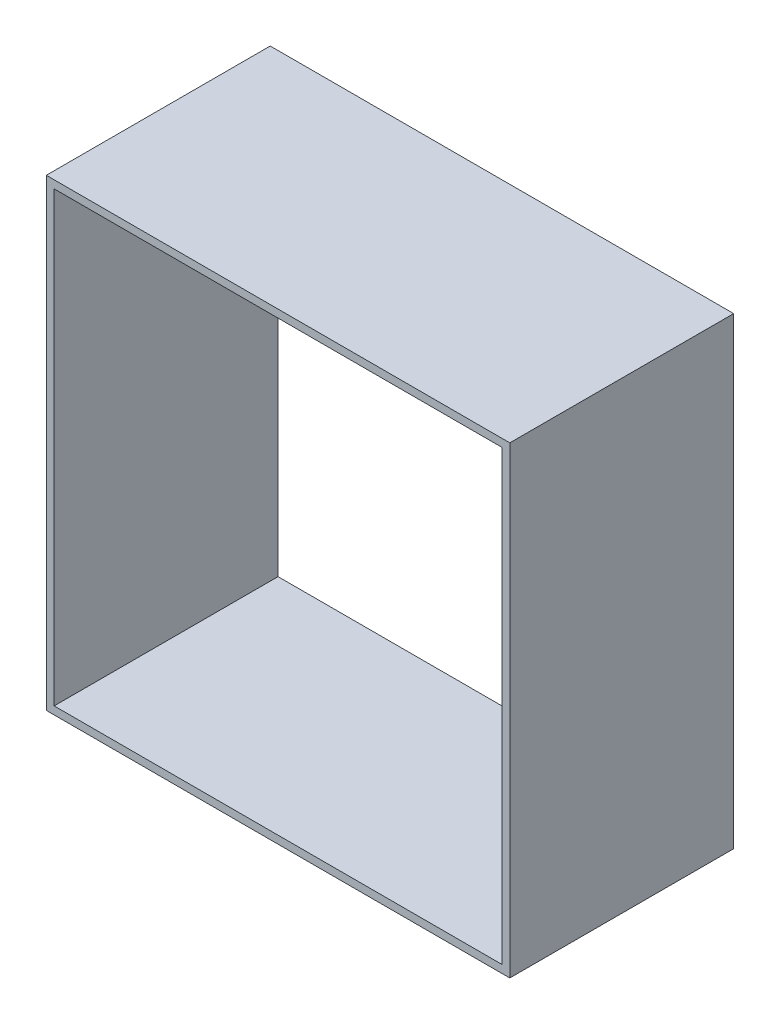
ISO-10303-21;
HEADER;
FILE_DESCRIPTION(('STEP AP214'),'2;1');
FILE_NAME('part.step','',(''),(''),'','','');
FILE_SCHEMA(('AUTOMOTIVE_DESIGN { 1 0 10303 214 1 1 1 1 }'));
ENDSEC;
DATA;
#1=APPLICATION_CONTEXT('core data for automotive mechanical design processes');
#2=APPLICATION_PROTOCOL_DEFINITION('international standard','automotive_design',2000,#1);
#3=PRODUCT_CONTEXT('',#1,'mechanical');
#4=PRODUCT('Part','Part','',(#3));
#5=PRODUCT_RELATED_PRODUCT_CATEGORY('part','',(#4));
#6=PRODUCT_DEFINITION_FORMATION('','',#4);
#7=PRODUCT_DEFINITION_CONTEXT('part definition',#1,'design');
#8=PRODUCT_DEFINITION('design','',#6,#7);
#9=PRODUCT_DEFINITION_SHAPE('','',#8);
#10=(LENGTH_UNIT() NAMED_UNIT(*) SI_UNIT(.MILLI.,.METRE.));
#11=(NAMED_UNIT(*) PLANE_ANGLE_UNIT() SI_UNIT($,.RADIAN.));
#12=(NAMED_UNIT(*) SI_UNIT($,.STERADIAN.) SOLID_ANGLE_UNIT());
#13=UNCERTAINTY_MEASURE_WITH_UNIT(LENGTH_MEASURE(1.E-05),#10,'distance_accuracy_value','');
#14=(GEOMETRIC_REPRESENTATION_CONTEXT(3) GLOBAL_UNCERTAINTY_ASSIGNED_CONTEXT((#13)) GLOBAL_UNIT_ASSIGNED_CONTEXT((#10,
#11,#12)) REPRESENTATION_CONTEXT('',''));
#15=CARTESIAN_POINT('',(0.,0.,0.));
#16=DIRECTION('',(0.,0.,1.));
#17=DIRECTION('',(1.,0.,0.));
#18=AXIS2_PLACEMENT_3D('',#15,#16,#17);
#19=CARTESIAN_POINT('',(10.35,-10.35,10.));
#20=DIRECTION('',(0.,0.,1.));
#21=DIRECTION('',(1.,0.,0.));
#22=AXIS2_PLACEMENT_3D('',#19,#20,#21);
#23=PLANE('',#22);
#24=DIRECTION('',(0.,1.,0.));
#25=VECTOR('',#24,1.);
#26=CARTESIAN_POINT('',(10.35,10.35,10.));
#27=LINE('',#26,#25);
#28=CARTESIAN_POINT('',(10.35,-10.35,10.));
#29=VERTEX_POINT('',#28);
#30=CARTESIAN_POINT('',(10.35,10.35,10.));
#31=VERTEX_POINT('',#30);
#32=EDGE_CURVE('E132',#29,#31,#27,.T.);
#33=ORIENTED_EDGE('',*,*,#32,.T.);
#34=DIRECTION('',(-1.,0.,0.));
#35=VECTOR('',#34,1.);
#36=CARTESIAN_POINT('',(-10.35,10.35,10.));
#37=LINE('',#36,#35);
#38=CARTESIAN_POINT('',(-10.35,10.35,10.));
#39=VERTEX_POINT('',#38);
#40=EDGE_CURVE('E135',#31,#39,#37,.T.);
#41=ORIENTED_EDGE('',*,*,#40,.T.);
#42=DIRECTION('',(0.,-1.,0.));
#43=VECTOR('',#42,1.);
#44=CARTESIAN_POINT('',(-10.35,10.35,10.));
#45=LINE('',#44,#43);
#46=CARTESIAN_POINT('',(-10.35,-10.35,10.));
#47=VERTEX_POINT('',#46);
#48=EDGE_CURVE('E138',#39,#47,#45,.T.);
#49=ORIENTED_EDGE('',*,*,#48,.T.);
#50=DIRECTION('',(1.,0.,0.));
#51=VECTOR('',#50,1.);
#52=CARTESIAN_POINT('',(-10.35,-10.35,10.));
#53=LINE('',#52,#51);
#54=EDGE_CURVE('E140',#47,#29,#53,.T.);
#55=ORIENTED_EDGE('',*,*,#54,.T.);
#56=EDGE_LOOP('',(#33,#41,#49,#55));
#57=FACE_BOUND('',#56,.T.);
#58=DIRECTION('',(-1.,0.,0.));
#59=VECTOR('',#58,1.);
#60=CARTESIAN_POINT('',(-10.,9.99999999999999,10.));
#61=LINE('',#60,#59);
#62=CARTESIAN_POINT('',(10.,9.99999999999999,10.));
#63=VERTEX_POINT('',#62);
#64=CARTESIAN_POINT('',(-10.,9.99999999999999,10.));
#65=VERTEX_POINT('',#64);
#66=EDGE_CURVE('E104',#63,#65,#61,.T.);
#67=ORIENTED_EDGE('',*,*,#66,.F.);
#68=DIRECTION('',(0.,1.,0.));
#69=VECTOR('',#68,1.);
#70=CARTESIAN_POINT('',(10.,9.99999999999999,10.));
#71=LINE('',#70,#69);
#72=CARTESIAN_POINT('',(10.,-10.,10.));
#73=VERTEX_POINT('',#72);
#74=EDGE_CURVE('E96',#73,#63,#71,.T.);
#75=ORIENTED_EDGE('',*,*,#74,.F.);
#76=DIRECTION('',(1.,0.,0.));
#77=VECTOR('',#76,1.);
#78=CARTESIAN_POINT('',(-10.,-10.,10.));
#79=LINE('',#78,#77);
#80=CARTESIAN_POINT('',(-10.,-10.,10.));
#81=VERTEX_POINT('',#80);
#82=EDGE_CURVE('E118',#81,#73,#79,.T.);
#83=ORIENTED_EDGE('',*,*,#82,.F.);
#84=DIRECTION('',(0.,-1.,0.));
#85=VECTOR('',#84,1.);
#86=CARTESIAN_POINT('',(-10.,9.99999999999999,10.));
#87=LINE('',#86,#85);
#88=EDGE_CURVE('E116',#65,#81,#87,.T.);
#89=ORIENTED_EDGE('',*,*,#88,.F.);
#90=EDGE_LOOP('',(#67,#75,#83,#89));
#91=FACE_BOUND('',#90,.T.);
#92=ADVANCED_FACE('F31',(#57,#91),#23,.T.);
#93=CARTESIAN_POINT('',(10.35,-10.35,0.));
#94=DIRECTION('',(0.,0.,1.));
#95=DIRECTION('',(1.,0.,0.));
#96=AXIS2_PLACEMENT_3D('',#93,#94,#95);
#97=PLANE('',#96);
#98=DIRECTION('',(0.,1.,0.));
#99=VECTOR('',#98,1.);
#100=CARTESIAN_POINT('',(10.35,10.35,0.));
#101=LINE('',#100,#99);
#102=CARTESIAN_POINT('',(10.35,-10.35,0.));
#103=VERTEX_POINT('',#102);
#104=CARTESIAN_POINT('',(10.35,10.35,0.));
#105=VERTEX_POINT('',#104);
#106=EDGE_CURVE('E112',#103,#105,#101,.T.);
#107=ORIENTED_EDGE('',*,*,#106,.F.);
#108=DIRECTION('',(1.,0.,0.));
#109=VECTOR('',#108,1.);
#110=CARTESIAN_POINT('',(-10.35,-10.35,0.));
#111=LINE('',#110,#109);
#112=CARTESIAN_POINT('',(-10.35,-10.35,0.));
#113=VERTEX_POINT('',#112);
#114=EDGE_CURVE('E136',#113,#103,#111,.T.);
#115=ORIENTED_EDGE('',*,*,#114,.F.);
#116=DIRECTION('',(0.,-1.,0.));
#117=VECTOR('',#116,1.);
#118=CARTESIAN_POINT('',(-10.35,10.35,0.));
#119=LINE('',#118,#117);
#120=CARTESIAN_POINT('',(-10.35,10.35,0.));
#121=VERTEX_POINT('',#120);
#122=EDGE_CURVE('E147',#121,#113,#119,.T.);
#123=ORIENTED_EDGE('',*,*,#122,.F.);
#124=DIRECTION('',(-1.,0.,0.));
#125=VECTOR('',#124,1.);
#126=CARTESIAN_POINT('',(-10.35,10.35,0.));
#127=LINE('',#126,#125);
#128=EDGE_CURVE('E145',#105,#121,#127,.T.);
#129=ORIENTED_EDGE('',*,*,#128,.F.);
#130=EDGE_LOOP('',(#107,#115,#123,#129));
#131=FACE_BOUND('',#130,.T.);
#132=DIRECTION('',(0.,1.,0.));
#133=VECTOR('',#132,1.);
#134=CARTESIAN_POINT('',(10.,9.99999999999999,0.));
#135=LINE('',#134,#133);
#136=CARTESIAN_POINT('',(10.,-10.,0.));
#137=VERTEX_POINT('',#136);
#138=CARTESIAN_POINT('',(10.,9.99999999999999,0.));
#139=VERTEX_POINT('',#138);
#140=EDGE_CURVE('E54',#137,#139,#135,.T.);
#141=ORIENTED_EDGE('',*,*,#140,.T.);
#142=DIRECTION('',(-1.,0.,0.));
#143=VECTOR('',#142,1.);
#144=CARTESIAN_POINT('',(-10.,9.99999999999999,0.));
#145=LINE('',#144,#143);
#146=CARTESIAN_POINT('',(-10.,9.99999999999999,0.));
#147=VERTEX_POINT('',#146);
#148=EDGE_CURVE('E111',#139,#147,#145,.T.);
#149=ORIENTED_EDGE('',*,*,#148,.T.);
#150=DIRECTION('',(0.,-1.,0.));
#151=VECTOR('',#150,1.);
#152=CARTESIAN_POINT('',(-10.,9.99999999999999,0.));
#153=LINE('',#152,#151);
#154=CARTESIAN_POINT('',(-10.,-10.,0.));
#155=VERTEX_POINT('',#154);
#156=EDGE_CURVE('E124',#147,#155,#153,.T.);
#157=ORIENTED_EDGE('',*,*,#156,.T.);
#158=DIRECTION('',(1.,0.,0.));
#159=VECTOR('',#158,1.);
#160=CARTESIAN_POINT('',(-10.,-10.,0.));
#161=LINE('',#160,#159);
#162=EDGE_CURVE('E105',#155,#137,#161,.T.);
#163=ORIENTED_EDGE('',*,*,#162,.T.);
#164=EDGE_LOOP('',(#141,#149,#157,#163));
#165=FACE_BOUND('',#164,.T.);
#166=ADVANCED_FACE('F165',(#131,#165),#97,.F.);
#167=CARTESIAN_POINT('',(10.35,10.35,10.));
#168=DIRECTION('',(-1.,0.,0.));
#169=DIRECTION('',(0.,0.,1.));
#170=AXIS2_PLACEMENT_3D('',#167,#168,#169);
#171=PLANE('',#170);
#172=ORIENTED_EDGE('',*,*,#106,.T.);
#173=DIRECTION('',(0.,0.,-1.));
#174=VECTOR('',#173,1.);
#175=CARTESIAN_POINT('',(10.35,10.35,10.));
#176=LINE('',#175,#174);
#177=EDGE_CURVE('E11',#31,#105,#176,.T.);
#178=ORIENTED_EDGE('',*,*,#177,.F.);
#179=ORIENTED_EDGE('',*,*,#32,.F.);
#180=DIRECTION('',(0.,0.,-1.));
#181=VECTOR('',#180,1.);
#182=CARTESIAN_POINT('',(10.35,-10.35,10.));
#183=LINE('',#182,#181);
#184=EDGE_CURVE('E142',#29,#103,#183,.T.);
#185=ORIENTED_EDGE('',*,*,#184,.T.);
#186=EDGE_LOOP('',(#172,#178,#179,#185));
#187=FACE_BOUND('',#186,.T.);
#188=ADVANCED_FACE('F33',(#187),#171,.F.);
#189=CARTESIAN_POINT('',(-10.35,10.35,10.));
#190=DIRECTION('',(0.,-1.,0.));
#191=DIRECTION('',(0.,0.,-1.));
#192=AXIS2_PLACEMENT_3D('',#189,#190,#191);
#193=PLANE('',#192);
#194=ORIENTED_EDGE('',*,*,#128,.T.);
#195=DIRECTION('',(0.,0.,-1.));
#196=VECTOR('',#195,1.);
#197=CARTESIAN_POINT('',(-10.35,10.35,10.));
#198=LINE('',#197,#196);
#199=EDGE_CURVE('E39',#39,#121,#198,.T.);
#200=ORIENTED_EDGE('',*,*,#199,.F.);
#201=ORIENTED_EDGE('',*,*,#40,.F.);
#202=ORIENTED_EDGE('',*,*,#177,.T.);
#203=EDGE_LOOP('',(#194,#200,#201,#202));
#204=FACE_BOUND('',#203,.T.);
#205=ADVANCED_FACE('F175',(#204),#193,.F.);
#206=CARTESIAN_POINT('',(-10.35,10.35,10.));
#207=DIRECTION('',(1.,0.,0.));
#208=DIRECTION('',(0.,0.,-1.));
#209=AXIS2_PLACEMENT_3D('',#206,#207,#208);
#210=PLANE('',#209);
#211=ORIENTED_EDGE('',*,*,#122,.T.);
#212=DIRECTION('',(0.,0.,-1.));
#213=VECTOR('',#212,1.);
#214=CARTESIAN_POINT('',(-10.35,-10.35,10.));
#215=LINE('',#214,#213);
#216=EDGE_CURVE('E152',#47,#113,#215,.T.);
#217=ORIENTED_EDGE('',*,*,#216,.F.);
#218=ORIENTED_EDGE('',*,*,#48,.F.);
#219=ORIENTED_EDGE('',*,*,#199,.T.);
#220=EDGE_LOOP('',(#211,#217,#218,#219));
#221=FACE_BOUND('',#220,.T.);
#222=ADVANCED_FACE('F159',(#221),#210,.F.);
#223=CARTESIAN_POINT('',(-10.35,-10.35,10.));
#224=DIRECTION('',(0.,1.,0.));
#225=DIRECTION('',(0.,0.,1.));
#226=AXIS2_PLACEMENT_3D('',#223,#224,#225);
#227=PLANE('',#226);
#228=ORIENTED_EDGE('',*,*,#114,.T.);
#229=ORIENTED_EDGE('',*,*,#184,.F.);
#230=ORIENTED_EDGE('',*,*,#54,.F.);
#231=ORIENTED_EDGE('',*,*,#216,.T.);
#232=EDGE_LOOP('',(#228,#229,#230,#231));
#233=FACE_BOUND('',#232,.T.);
#234=ADVANCED_FACE('F169',(#233),#227,.F.);
#235=CARTESIAN_POINT('',(10.,9.99999999999999,10.));
#236=DIRECTION('',(-1.,0.,0.));
#237=DIRECTION('',(0.,0.,1.));
#238=AXIS2_PLACEMENT_3D('',#235,#236,#237);
#239=PLANE('',#238);
#240=ORIENTED_EDGE('',*,*,#140,.F.);
#241=DIRECTION('',(0.,0.,-1.));
#242=VECTOR('',#241,1.);
#243=CARTESIAN_POINT('',(10.,-10.,10.));
#244=LINE('',#243,#242);
#245=EDGE_CURVE('E100',#73,#137,#244,.T.);
#246=ORIENTED_EDGE('',*,*,#245,.F.);
#247=ORIENTED_EDGE('',*,*,#74,.T.);
#248=DIRECTION('',(0.,0.,-1.));
#249=VECTOR('',#248,1.);
#250=CARTESIAN_POINT('',(10.,9.99999999999999,10.));
#251=LINE('',#250,#249);
#252=EDGE_CURVE('E99',#63,#139,#251,.T.);
#253=ORIENTED_EDGE('',*,*,#252,.T.);
#254=EDGE_LOOP('',(#240,#246,#247,#253));
#255=FACE_BOUND('',#254,.T.);
#256=ADVANCED_FACE('F98',(#255),#239,.T.);
#257=CARTESIAN_POINT('',(-10.,9.99999999999999,10.));
#258=DIRECTION('',(0.,-1.,0.));
#259=DIRECTION('',(0.,0.,-1.));
#260=AXIS2_PLACEMENT_3D('',#257,#258,#259);
#261=PLANE('',#260);
#262=ORIENTED_EDGE('',*,*,#148,.F.);
#263=ORIENTED_EDGE('',*,*,#252,.F.);
#264=ORIENTED_EDGE('',*,*,#66,.T.);
#265=DIRECTION('',(0.,0.,-1.));
#266=VECTOR('',#265,1.);
#267=CARTESIAN_POINT('',(-10.,9.99999999999999,10.));
#268=LINE('',#267,#266);
#269=EDGE_CURVE('E113',#65,#147,#268,.T.);
#270=ORIENTED_EDGE('',*,*,#269,.T.);
#271=EDGE_LOOP('',(#262,#263,#264,#270));
#272=FACE_BOUND('',#271,.T.);
#273=ADVANCED_FACE('F108',(#272),#261,.T.);
#274=CARTESIAN_POINT('',(-10.,9.99999999999999,10.));
#275=DIRECTION('',(1.,0.,0.));
#276=DIRECTION('',(0.,0.,-1.));
#277=AXIS2_PLACEMENT_3D('',#274,#275,#276);
#278=PLANE('',#277);
#279=ORIENTED_EDGE('',*,*,#156,.F.);
#280=ORIENTED_EDGE('',*,*,#269,.F.);
#281=ORIENTED_EDGE('',*,*,#88,.T.);
#282=DIRECTION('',(0.,0.,-1.));
#283=VECTOR('',#282,1.);
#284=CARTESIAN_POINT('',(-10.,-10.,10.));
#285=LINE('',#284,#283);
#286=EDGE_CURVE('E46',#81,#155,#285,.T.);
#287=ORIENTED_EDGE('',*,*,#286,.T.);
#288=EDGE_LOOP('',(#279,#280,#281,#287));
#289=FACE_BOUND('',#288,.T.);
#290=ADVANCED_FACE('F198',(#289),#278,.T.);
#291=CARTESIAN_POINT('',(-10.,-10.,10.));
#292=DIRECTION('',(0.,1.,0.));
#293=DIRECTION('',(0.,0.,1.));
#294=AXIS2_PLACEMENT_3D('',#291,#292,#293);
#295=PLANE('',#294);
#296=ORIENTED_EDGE('',*,*,#162,.F.);
#297=ORIENTED_EDGE('',*,*,#286,.F.);
#298=ORIENTED_EDGE('',*,*,#82,.T.);
#299=ORIENTED_EDGE('',*,*,#245,.T.);
#300=EDGE_LOOP('',(#296,#297,#298,#299));
#301=FACE_BOUND('',#300,.T.);
#302=ADVANCED_FACE('F202',(#301),#295,.T.);
#303=CLOSED_SHELL('',(#92,#166,#188,#205,#222,#234,#256,#273,#290,#302));
#304=MANIFOLD_SOLID_BREP('B2',#303);
#305=ADVANCED_BREP_SHAPE_REPRESENTATION('',(#18,#304),#14);
#306=SHAPE_DEFINITION_REPRESENTATION(#9,#305);
ENDSEC;
END-ISO-10303-21;
